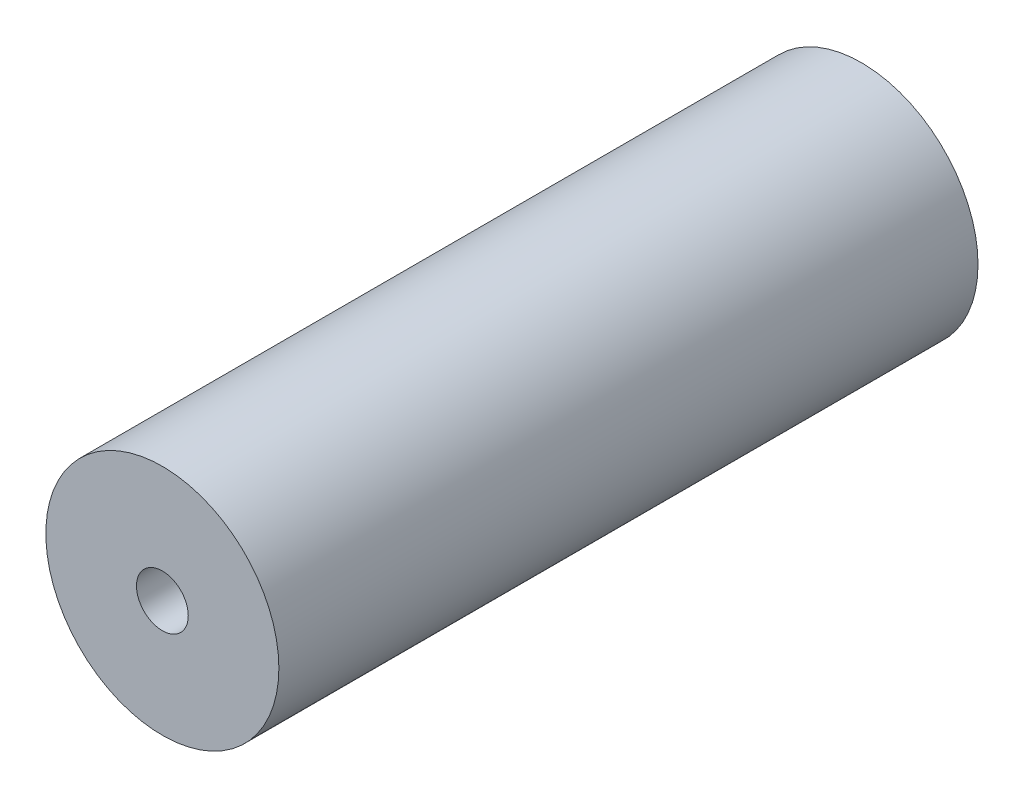
ISO-10303-21;
HEADER;
FILE_DESCRIPTION(('STEP AP214'),'2;1');
FILE_NAME('part.step','',(''),(''),'','','');
FILE_SCHEMA(('AUTOMOTIVE_DESIGN { 1 0 10303 214 1 1 1 1 }'));
ENDSEC;
DATA;
#1=APPLICATION_CONTEXT('core data for automotive mechanical design processes');
#2=APPLICATION_PROTOCOL_DEFINITION('international standard','automotive_design',2000,#1);
#3=PRODUCT_CONTEXT('',#1,'mechanical');
#4=PRODUCT('Part','Part','',(#3));
#5=PRODUCT_RELATED_PRODUCT_CATEGORY('part','',(#4));
#6=PRODUCT_DEFINITION_FORMATION('','',#4);
#7=PRODUCT_DEFINITION_CONTEXT('part definition',#1,'design');
#8=PRODUCT_DEFINITION('design','',#6,#7);
#9=PRODUCT_DEFINITION_SHAPE('','',#8);
#10=(LENGTH_UNIT() NAMED_UNIT(*) SI_UNIT(.MILLI.,.METRE.));
#11=(NAMED_UNIT(*) PLANE_ANGLE_UNIT() SI_UNIT($,.RADIAN.));
#12=(NAMED_UNIT(*) SI_UNIT($,.STERADIAN.) SOLID_ANGLE_UNIT());
#13=UNCERTAINTY_MEASURE_WITH_UNIT(LENGTH_MEASURE(1.E-05),#10,'distance_accuracy_value','');
#14=(GEOMETRIC_REPRESENTATION_CONTEXT(3) GLOBAL_UNCERTAINTY_ASSIGNED_CONTEXT((#13)) GLOBAL_UNIT_ASSIGNED_CONTEXT((#10,
#11,#12)) REPRESENTATION_CONTEXT('',''));
#15=CARTESIAN_POINT('',(0.,0.,0.));
#16=DIRECTION('',(0.,0.,1.));
#17=DIRECTION('',(1.,0.,0.));
#18=AXIS2_PLACEMENT_3D('',#15,#16,#17);
#19=CARTESIAN_POINT('',(0.,0.,-54.));
#20=DIRECTION('',(0.,0.,1.));
#21=DIRECTION('',(1.,0.,0.));
#22=AXIS2_PLACEMENT_3D('',#19,#20,#21);
#23=CYLINDRICAL_SURFACE('',#22,18.);
#24=CARTESIAN_POINT('',(0.,0.,-54.));
#25=DIRECTION('',(0.,0.,1.));
#26=DIRECTION('',(1.,0.,0.));
#27=AXIS2_PLACEMENT_3D('',#24,#25,#26);
#28=CIRCLE('',#27,18.);
#29=CARTESIAN_POINT('',(18.,0.,-54.));
#30=VERTEX_POINT('',#29);
#31=EDGE_CURVE('E10',#30,#30,#28,.T.);
#32=ORIENTED_EDGE('',*,*,#31,.T.);
#33=EDGE_LOOP('',(#32));
#34=FACE_BOUND('',#33,.T.);
#35=CARTESIAN_POINT('',(0.,0.,54.));
#36=DIRECTION('',(0.,0.,1.));
#37=DIRECTION('',(1.,0.,0.));
#38=AXIS2_PLACEMENT_3D('',#35,#36,#37);
#39=CIRCLE('',#38,18.);
#40=CARTESIAN_POINT('',(18.,0.,54.));
#41=VERTEX_POINT('',#40);
#42=EDGE_CURVE('E37',#41,#41,#39,.T.);
#43=ORIENTED_EDGE('',*,*,#42,.F.);
#44=EDGE_LOOP('',(#43));
#45=FACE_BOUND('',#44,.T.);
#46=ADVANCED_FACE('F31',(#34,#45),#23,.T.);
#47=CARTESIAN_POINT('',(0.,0.,-54.));
#48=DIRECTION('',(0.,0.,1.));
#49=DIRECTION('',(1.,0.,0.));
#50=AXIS2_PLACEMENT_3D('',#47,#48,#49);
#51=PLANE('',#50);
#52=CARTESIAN_POINT('',(0.,14.,-54.));
#53=DIRECTION('',(0.,0.,-1.));
#54=DIRECTION('',(-1.,0.,0.));
#55=AXIS2_PLACEMENT_3D('',#52,#53,#54);
#56=CIRCLE('',#55,1.5);
#57=CARTESIAN_POINT('',(-1.5,14.,-54.));
#58=VERTEX_POINT('',#57);
#59=EDGE_CURVE('E69',#58,#58,#56,.T.);
#60=ORIENTED_EDGE('',*,*,#59,.F.);
#61=EDGE_LOOP('',(#60));
#62=FACE_BOUND('',#61,.T.);
#63=CARTESIAN_POINT('',(-14.,0.,-54.));
#64=DIRECTION('',(0.,0.,-1.));
#65=DIRECTION('',(-1.,0.,0.));
#66=AXIS2_PLACEMENT_3D('',#63,#64,#65);
#67=CIRCLE('',#66,1.5);
#68=CARTESIAN_POINT('',(-15.5,0.,-54.));
#69=VERTEX_POINT('',#68);
#70=EDGE_CURVE('E63',#69,#69,#67,.T.);
#71=ORIENTED_EDGE('',*,*,#70,.F.);
#72=EDGE_LOOP('',(#71));
#73=FACE_BOUND('',#72,.T.);
#74=CARTESIAN_POINT('',(0.,-14.,-54.));
#75=DIRECTION('',(0.,0.,-1.));
#76=DIRECTION('',(-1.,0.,0.));
#77=AXIS2_PLACEMENT_3D('',#74,#75,#76);
#78=CIRCLE('',#77,1.5);
#79=CARTESIAN_POINT('',(-1.5,-14.,-54.));
#80=VERTEX_POINT('',#79);
#81=EDGE_CURVE('E57',#80,#80,#78,.T.);
#82=ORIENTED_EDGE('',*,*,#81,.F.);
#83=EDGE_LOOP('',(#82));
#84=FACE_BOUND('',#83,.T.);
#85=CARTESIAN_POINT('',(14.,0.,-54.));
#86=DIRECTION('',(0.,0.,-1.));
#87=DIRECTION('',(-1.,0.,0.));
#88=AXIS2_PLACEMENT_3D('',#85,#86,#87);
#89=CIRCLE('',#88,1.5);
#90=CARTESIAN_POINT('',(12.5,0.,-54.));
#91=VERTEX_POINT('',#90);
#92=EDGE_CURVE('E51',#91,#91,#89,.T.);
#93=ORIENTED_EDGE('',*,*,#92,.F.);
#94=EDGE_LOOP('',(#93));
#95=FACE_BOUND('',#94,.T.);
#96=CARTESIAN_POINT('',(0.,0.,-54.));
#97=DIRECTION('',(0.,0.,1.));
#98=DIRECTION('',(1.,0.,0.));
#99=AXIS2_PLACEMENT_3D('',#96,#97,#98);
#100=CIRCLE('',#99,4.);
#101=CARTESIAN_POINT('',(4.,0.,-54.));
#102=VERTEX_POINT('',#101);
#103=EDGE_CURVE('E41',#102,#102,#100,.T.);
#104=ORIENTED_EDGE('',*,*,#103,.T.);
#105=EDGE_LOOP('',(#104));
#106=FACE_BOUND('',#105,.T.);
#107=ORIENTED_EDGE('',*,*,#31,.F.);
#108=EDGE_LOOP('',(#107));
#109=FACE_BOUND('',#108,.T.);
#110=ADVANCED_FACE('F84',(#62,#73,#84,#95,#106,#109),#51,.F.);
#111=CARTESIAN_POINT('',(0.,0.,54.));
#112=DIRECTION('',(0.,0.,1.));
#113=DIRECTION('',(1.,0.,0.));
#114=AXIS2_PLACEMENT_3D('',#111,#112,#113);
#115=PLANE('',#114);
#116=CARTESIAN_POINT('',(0.,0.,54.));
#117=DIRECTION('',(0.,0.,1.));
#118=DIRECTION('',(1.,0.,0.));
#119=AXIS2_PLACEMENT_3D('',#116,#117,#118);
#120=CIRCLE('',#119,4.);
#121=CARTESIAN_POINT('',(4.,0.,54.));
#122=VERTEX_POINT('',#121);
#123=EDGE_CURVE('E45',#122,#122,#120,.T.);
#124=ORIENTED_EDGE('',*,*,#123,.F.);
#125=EDGE_LOOP('',(#124));
#126=FACE_BOUND('',#125,.T.);
#127=ORIENTED_EDGE('',*,*,#42,.T.);
#128=EDGE_LOOP('',(#127));
#129=FACE_BOUND('',#128,.T.);
#130=ADVANCED_FACE('F87',(#126,#129),#115,.T.);
#131=CARTESIAN_POINT('',(0.,0.,-68.));
#132=DIRECTION('',(0.,0.,1.));
#133=DIRECTION('',(1.,0.,0.));
#134=AXIS2_PLACEMENT_3D('',#131,#132,#133);
#135=CYLINDRICAL_SURFACE('',#134,4.);
#136=CARTESIAN_POINT('',(4.,0.,54.));
#137=CARTESIAN_POINT('',(4.,0.,52.875));
#138=CARTESIAN_POINT('',(4.,0.,51.75));
#139=CARTESIAN_POINT('',(4.,0.,49.5));
#140=CARTESIAN_POINT('',(4.,0.,48.375));
#141=CARTESIAN_POINT('',(4.,0.,46.125));
#142=CARTESIAN_POINT('',(4.,0.,45.));
#143=CARTESIAN_POINT('',(4.,0.,42.75));
#144=CARTESIAN_POINT('',(4.,0.,41.625));
#145=CARTESIAN_POINT('',(4.,0.,39.375));
#146=CARTESIAN_POINT('',(4.,0.,38.25));
#147=CARTESIAN_POINT('',(4.,0.,36.));
#148=CARTESIAN_POINT('',(4.,0.,34.875));
#149=CARTESIAN_POINT('',(4.,0.,32.625));
#150=CARTESIAN_POINT('',(4.,0.,31.5));
#151=CARTESIAN_POINT('',(4.,0.,29.25));
#152=CARTESIAN_POINT('',(4.,0.,28.125));
#153=CARTESIAN_POINT('',(4.,0.,25.875));
#154=CARTESIAN_POINT('',(4.,0.,24.75));
#155=CARTESIAN_POINT('',(4.,0.,22.5));
#156=CARTESIAN_POINT('',(4.,0.,21.375));
#157=CARTESIAN_POINT('',(4.,0.,19.125));
#158=CARTESIAN_POINT('',(4.,0.,18.));
#159=CARTESIAN_POINT('',(4.,0.,15.75));
#160=CARTESIAN_POINT('',(4.,0.,14.625));
#161=CARTESIAN_POINT('',(4.,0.,12.375));
#162=CARTESIAN_POINT('',(4.,0.,11.25));
#163=CARTESIAN_POINT('',(4.,0.,9.));
#164=CARTESIAN_POINT('',(4.,0.,7.875));
#165=CARTESIAN_POINT('',(4.,0.,5.625));
#166=CARTESIAN_POINT('',(4.,0.,4.5));
#167=CARTESIAN_POINT('',(4.,0.,2.25));
#168=CARTESIAN_POINT('',(4.,0.,1.125));
#169=CARTESIAN_POINT('',(4.,0.,-1.125));
#170=CARTESIAN_POINT('',(4.,0.,-2.25));
#171=CARTESIAN_POINT('',(4.,0.,-4.5));
#172=CARTESIAN_POINT('',(4.,0.,-5.625));
#173=CARTESIAN_POINT('',(4.,0.,-7.87499999999999));
#174=CARTESIAN_POINT('',(4.,0.,-8.99999999999999));
#175=CARTESIAN_POINT('',(4.,0.,-11.25));
#176=CARTESIAN_POINT('',(4.,0.,-12.375));
#177=CARTESIAN_POINT('',(4.,0.,-14.625));
#178=CARTESIAN_POINT('',(4.,0.,-15.75));
#179=CARTESIAN_POINT('',(4.,0.,-18.));
#180=CARTESIAN_POINT('',(4.,0.,-19.125));
#181=CARTESIAN_POINT('',(4.,0.,-21.375));
#182=CARTESIAN_POINT('',(4.,0.,-22.5));
#183=CARTESIAN_POINT('',(4.,0.,-24.75));
#184=CARTESIAN_POINT('',(4.,0.,-25.875));
#185=CARTESIAN_POINT('',(4.,0.,-28.125));
#186=CARTESIAN_POINT('',(4.,0.,-29.25));
#187=CARTESIAN_POINT('',(4.,0.,-31.5));
#188=CARTESIAN_POINT('',(4.,0.,-32.625));
#189=CARTESIAN_POINT('',(4.,0.,-34.875));
#190=CARTESIAN_POINT('',(4.,0.,-36.));
#191=CARTESIAN_POINT('',(4.,0.,-38.25));
#192=CARTESIAN_POINT('',(4.,0.,-39.375));
#193=CARTESIAN_POINT('',(4.,0.,-41.625));
#194=CARTESIAN_POINT('',(4.,0.,-42.75));
#195=CARTESIAN_POINT('',(4.,0.,-45.));
#196=CARTESIAN_POINT('',(4.,0.,-46.125));
#197=CARTESIAN_POINT('',(4.,0.,-48.375));
#198=CARTESIAN_POINT('',(4.,0.,-49.5));
#199=CARTESIAN_POINT('',(4.,0.,-51.75));
#200=CARTESIAN_POINT('',(4.,0.,-52.875));
#201=CARTESIAN_POINT('',(4.,0.,-54.));
#202=B_SPLINE_CURVE_WITH_KNOTS('',3,(#136,#137,#138,#139,#140,#141,#142,#143,#144,#145,#146,
#147,#148,#149,#150,#151,#152,#153,#154,#155,#156,#157,#158,#159,#160,#161,#162,#163,#164,#165,
#166,#167,#168,#169,#170,#171,#172,#173,#174,#175,#176,#177,#178,#179,#180,#181,#182,#183,#184,
#185,#186,#187,#188,#189,#190,#191,#192,#193,#194,#195,#196,#197,#198,#199,#200,#201),
.UNSPECIFIED.,.F.,.F.,(4,2,2,2,2,2,2,2,2,2,2,2,2,2,2,2,2,2,2,2,2,2,2,2,2,2,2,2,2,2,2,2,4),(0.,
3.375,6.75000000000001,10.125,13.5,16.875,20.25,23.625,27.,30.375,33.75,37.125,40.5,43.875,
47.25,50.625,54.,57.375,60.75,64.125,67.5,70.875,74.25,77.625,81.,84.375,87.75,91.125,94.5,
97.875,101.25,104.625,108.),.UNSPECIFIED.);
#203=EDGE_CURVE('BSEAM97',#122,#102,#202,.T.);
#204=ORIENTED_EDGE('',*,*,#123,.T.);
#205=ORIENTED_EDGE('',*,*,#103,.F.);
#206=ORIENTED_EDGE('',*,*,#203,.T.);
#207=ORIENTED_EDGE('',*,*,#203,.F.);
#208=EDGE_LOOP('',(#204,#206,#205,#207));
#209=FACE_BOUND('',#208,.T.);
#210=ADVANCED_FACE('F97',(#209),#135,.F.);
#211=CARTESIAN_POINT('',(14.,0.,-49.));
#212=DIRECTION('',(0.,0.,-1.));
#213=DIRECTION('',(-1.,0.,0.));
#214=AXIS2_PLACEMENT_3D('',#211,#212,#213);
#215=CYLINDRICAL_SURFACE('',#214,1.5);
#216=CARTESIAN_POINT('',(14.,0.,-49.));
#217=DIRECTION('',(0.,0.,-1.));
#218=DIRECTION('',(-1.,0.,0.));
#219=AXIS2_PLACEMENT_3D('',#216,#217,#218);
#220=CIRCLE('',#219,1.5);
#221=CARTESIAN_POINT('',(12.5,0.,-49.));
#222=VERTEX_POINT('',#221);
#223=EDGE_CURVE('E54',#222,#222,#220,.T.);
#224=ORIENTED_EDGE('',*,*,#223,.F.);
#225=EDGE_LOOP('',(#224));
#226=FACE_BOUND('',#225,.T.);
#227=ORIENTED_EDGE('',*,*,#92,.T.);
#228=EDGE_LOOP('',(#227));
#229=FACE_BOUND('',#228,.T.);
#230=ADVANCED_FACE('F99',(#226,#229),#215,.F.);
#231=CARTESIAN_POINT('',(14.,0.,-49.));
#232=DIRECTION('',(0.,0.,-1.));
#233=DIRECTION('',(-1.,0.,0.));
#234=AXIS2_PLACEMENT_3D('',#231,#232,#233);
#235=PLANE('',#234);
#236=ORIENTED_EDGE('',*,*,#223,.T.);
#237=EDGE_LOOP('',(#236));
#238=FACE_BOUND('',#237,.T.);
#239=ADVANCED_FACE('F106',(#238),#235,.T.);
#240=CARTESIAN_POINT('',(0.,-14.,-49.));
#241=DIRECTION('',(0.,0.,-1.));
#242=DIRECTION('',(-1.,0.,0.));
#243=AXIS2_PLACEMENT_3D('',#240,#241,#242);
#244=CYLINDRICAL_SURFACE('',#243,1.5);
#245=CARTESIAN_POINT('',(0.,-14.,-49.));
#246=DIRECTION('',(0.,0.,-1.));
#247=DIRECTION('',(-1.,0.,0.));
#248=AXIS2_PLACEMENT_3D('',#245,#246,#247);
#249=CIRCLE('',#248,1.5);
#250=CARTESIAN_POINT('',(-1.5,-14.,-49.));
#251=VERTEX_POINT('',#250);
#252=EDGE_CURVE('E60',#251,#251,#249,.T.);
#253=ORIENTED_EDGE('',*,*,#252,.F.);
#254=EDGE_LOOP('',(#253));
#255=FACE_BOUND('',#254,.T.);
#256=ORIENTED_EDGE('',*,*,#81,.T.);
#257=EDGE_LOOP('',(#256));
#258=FACE_BOUND('',#257,.T.);
#259=ADVANCED_FACE('F142',(#255,#258),#244,.F.);
#260=CARTESIAN_POINT('',(0.,-14.,-49.));
#261=DIRECTION('',(0.,0.,-1.));
#262=DIRECTION('',(-1.,0.,0.));
#263=AXIS2_PLACEMENT_3D('',#260,#261,#262);
#264=PLANE('',#263);
#265=ORIENTED_EDGE('',*,*,#252,.T.);
#266=EDGE_LOOP('',(#265));
#267=FACE_BOUND('',#266,.T.);
#268=ADVANCED_FACE('F151',(#267),#264,.T.);
#269=CARTESIAN_POINT('',(-14.,0.,-49.));
#270=DIRECTION('',(0.,0.,-1.));
#271=DIRECTION('',(-1.,0.,0.));
#272=AXIS2_PLACEMENT_3D('',#269,#270,#271);
#273=CYLINDRICAL_SURFACE('',#272,1.5);
#274=CARTESIAN_POINT('',(-14.,0.,-49.));
#275=DIRECTION('',(0.,0.,-1.));
#276=DIRECTION('',(-1.,0.,0.));
#277=AXIS2_PLACEMENT_3D('',#274,#275,#276);
#278=CIRCLE('',#277,1.5);
#279=CARTESIAN_POINT('',(-15.5,0.,-49.));
#280=VERTEX_POINT('',#279);
#281=EDGE_CURVE('E66',#280,#280,#278,.T.);
#282=ORIENTED_EDGE('',*,*,#281,.F.);
#283=EDGE_LOOP('',(#282));
#284=FACE_BOUND('',#283,.T.);
#285=ORIENTED_EDGE('',*,*,#70,.T.);
#286=EDGE_LOOP('',(#285));
#287=FACE_BOUND('',#286,.T.);
#288=ADVANCED_FACE('F160',(#284,#287),#273,.F.);
#289=CARTESIAN_POINT('',(-14.,0.,-49.));
#290=DIRECTION('',(0.,0.,-1.));
#291=DIRECTION('',(-1.,0.,0.));
#292=AXIS2_PLACEMENT_3D('',#289,#290,#291);
#293=PLANE('',#292);
#294=ORIENTED_EDGE('',*,*,#281,.T.);
#295=EDGE_LOOP('',(#294));
#296=FACE_BOUND('',#295,.T.);
#297=ADVANCED_FACE('F80',(#296),#293,.T.);
#298=CARTESIAN_POINT('',(0.,14.,-49.));
#299=DIRECTION('',(0.,0.,-1.));
#300=DIRECTION('',(-1.,0.,0.));
#301=AXIS2_PLACEMENT_3D('',#298,#299,#300);
#302=CYLINDRICAL_SURFACE('',#301,1.5);
#303=CARTESIAN_POINT('',(0.,14.,-49.));
#304=DIRECTION('',(0.,0.,-1.));
#305=DIRECTION('',(-1.,0.,0.));
#306=AXIS2_PLACEMENT_3D('',#303,#304,#305);
#307=CIRCLE('',#306,1.5);
#308=CARTESIAN_POINT('',(-1.5,14.,-49.));
#309=VERTEX_POINT('',#308);
#310=EDGE_CURVE('E50',#309,#309,#307,.T.);
#311=ORIENTED_EDGE('',*,*,#310,.F.);
#312=EDGE_LOOP('',(#311));
#313=FACE_BOUND('',#312,.T.);
#314=ORIENTED_EDGE('',*,*,#59,.T.);
#315=EDGE_LOOP('',(#314));
#316=FACE_BOUND('',#315,.T.);
#317=ADVANCED_FACE('F77',(#313,#316),#302,.F.);
#318=CARTESIAN_POINT('',(0.,14.,-49.));
#319=DIRECTION('',(0.,0.,-1.));
#320=DIRECTION('',(-1.,0.,0.));
#321=AXIS2_PLACEMENT_3D('',#318,#319,#320);
#322=PLANE('',#321);
#323=ORIENTED_EDGE('',*,*,#310,.T.);
#324=EDGE_LOOP('',(#323));
#325=FACE_BOUND('',#324,.T.);
#326=ADVANCED_FACE('F75',(#325),#322,.T.);
#327=CLOSED_SHELL('',(#46,#110,#130,#210,#230,#239,#259,#268,#288,#297,#317,#326));
#328=MANIFOLD_SOLID_BREP('B2',#327);
#329=ADVANCED_BREP_SHAPE_REPRESENTATION('',(#18,#328),#14);
#330=SHAPE_DEFINITION_REPRESENTATION(#9,#329);
ENDSEC;
END-ISO-10303-21;
